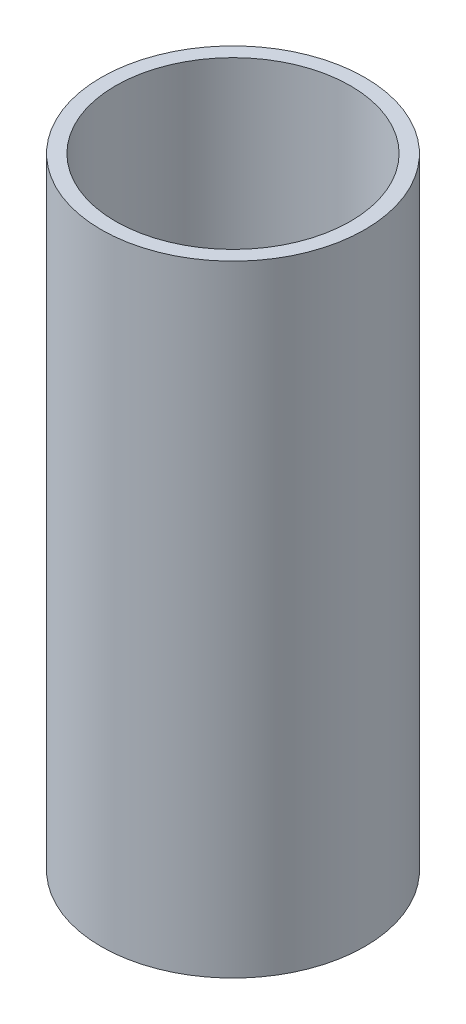
ISO-10303-21;
HEADER;
FILE_DESCRIPTION(('STEP AP214'),'2;1');
FILE_NAME('part.step','',(''),(''),'','','');
FILE_SCHEMA(('AUTOMOTIVE_DESIGN { 1 0 10303 214 1 1 1 1 }'));
ENDSEC;
DATA;
#1=APPLICATION_CONTEXT('core data for automotive mechanical design processes');
#2=APPLICATION_PROTOCOL_DEFINITION('international standard','automotive_design',2000,#1);
#3=PRODUCT_CONTEXT('',#1,'mechanical');
#4=PRODUCT('Part','Part','',(#3));
#5=PRODUCT_RELATED_PRODUCT_CATEGORY('part','',(#4));
#6=PRODUCT_DEFINITION_FORMATION('','',#4);
#7=PRODUCT_DEFINITION_CONTEXT('part definition',#1,'design');
#8=PRODUCT_DEFINITION('design','',#6,#7);
#9=PRODUCT_DEFINITION_SHAPE('','',#8);
#10=(LENGTH_UNIT() NAMED_UNIT(*) SI_UNIT(.MILLI.,.METRE.));
#11=(NAMED_UNIT(*) PLANE_ANGLE_UNIT() SI_UNIT($,.RADIAN.));
#12=(NAMED_UNIT(*) SI_UNIT($,.STERADIAN.) SOLID_ANGLE_UNIT());
#13=UNCERTAINTY_MEASURE_WITH_UNIT(LENGTH_MEASURE(1.E-05),#10,'distance_accuracy_value','');
#14=(GEOMETRIC_REPRESENTATION_CONTEXT(3) GLOBAL_UNCERTAINTY_ASSIGNED_CONTEXT((#13)) GLOBAL_UNIT_ASSIGNED_CONTEXT((#10,
#11,#12)) REPRESENTATION_CONTEXT('',''));
#15=CARTESIAN_POINT('',(0.,0.,0.));
#16=DIRECTION('',(0.,0.,1.));
#17=DIRECTION('',(1.,0.,0.));
#18=AXIS2_PLACEMENT_3D('',#15,#16,#17);
#19=CARTESIAN_POINT('',(0.,51.8,0.));
#20=DIRECTION('',(0.,1.,0.));
#21=DIRECTION('',(0.,0.,1.));
#22=AXIS2_PLACEMENT_3D('',#19,#20,#21);
#23=PLANE('',#22);
#24=CARTESIAN_POINT('',(0.,51.8,0.));
#25=DIRECTION('',(0.,1.,0.));
#26=DIRECTION('',(0.,0.,1.));
#27=AXIS2_PLACEMENT_3D('',#24,#25,#26);
#28=CIRCLE('',#27,11.);
#29=CARTESIAN_POINT('',(0.,51.8,-11.));
#30=VERTEX_POINT('',#29);
#31=EDGE_CURVE('E10',#30,#30,#28,.T.);
#32=ORIENTED_EDGE('',*,*,#31,.T.);
#33=EDGE_LOOP('',(#32));
#34=FACE_BOUND('',#33,.T.);
#35=CARTESIAN_POINT('',(0.,51.8,0.));
#36=DIRECTION('',(0.,1.,0.));
#37=DIRECTION('',(0.,0.,1.));
#38=AXIS2_PLACEMENT_3D('',#35,#36,#37);
#39=CIRCLE('',#38,9.8);
#40=CARTESIAN_POINT('',(0.,51.8,-9.8));
#41=VERTEX_POINT('',#40);
#42=EDGE_CURVE('E42',#41,#41,#39,.T.);
#43=ORIENTED_EDGE('',*,*,#42,.F.);
#44=EDGE_LOOP('',(#43));
#45=FACE_BOUND('',#44,.T.);
#46=ADVANCED_FACE('F31',(#34,#45),#23,.T.);
#47=CARTESIAN_POINT('',(0.,0.,0.));
#48=DIRECTION('',(0.,1.,0.));
#49=DIRECTION('',(0.,0.,1.));
#50=AXIS2_PLACEMENT_3D('',#47,#48,#49);
#51=PLANE('',#50);
#52=CARTESIAN_POINT('',(0.,0.,0.));
#53=DIRECTION('',(0.,1.,0.));
#54=DIRECTION('',(0.,0.,1.));
#55=AXIS2_PLACEMENT_3D('',#52,#53,#54);
#56=CIRCLE('',#55,11.);
#57=CARTESIAN_POINT('',(0.,0.,-11.));
#58=VERTEX_POINT('',#57);
#59=EDGE_CURVE('E35',#58,#58,#56,.T.);
#60=ORIENTED_EDGE('',*,*,#59,.F.);
#61=EDGE_LOOP('',(#60));
#62=FACE_BOUND('',#61,.T.);
#63=CARTESIAN_POINT('',(0.,0.,0.));
#64=DIRECTION('',(0.,1.,0.));
#65=DIRECTION('',(0.,0.,1.));
#66=AXIS2_PLACEMENT_3D('',#63,#64,#65);
#67=CIRCLE('',#66,9.8);
#68=CARTESIAN_POINT('',(0.,0.,-9.8));
#69=VERTEX_POINT('',#68);
#70=EDGE_CURVE('E44',#69,#69,#67,.T.);
#71=ORIENTED_EDGE('',*,*,#70,.T.);
#72=EDGE_LOOP('',(#71));
#73=FACE_BOUND('',#72,.T.);
#74=ADVANCED_FACE('F54',(#62,#73),#51,.F.);
#75=CARTESIAN_POINT('',(0.,51.8,0.));
#76=DIRECTION('',(0.,-1.,0.));
#77=DIRECTION('',(0.,0.,-1.));
#78=AXIS2_PLACEMENT_3D('',#75,#76,#77);
#79=CYLINDRICAL_SURFACE('',#78,11.);
#80=CARTESIAN_POINT('',(0.,51.8,-11.));
#81=CARTESIAN_POINT('',(0.,51.2604166666667,-11.));
#82=CARTESIAN_POINT('',(0.,50.7208333333333,-11.));
#83=CARTESIAN_POINT('',(0.,49.6416666666667,-11.));
#84=CARTESIAN_POINT('',(0.,49.1020833333333,-11.));
#85=CARTESIAN_POINT('',(0.,48.0229166666667,-11.));
#86=CARTESIAN_POINT('',(0.,47.4833333333333,-11.));
#87=CARTESIAN_POINT('',(0.,46.4041666666667,-11.));
#88=CARTESIAN_POINT('',(0.,45.8645833333333,-11.));
#89=CARTESIAN_POINT('',(0.,44.7854166666667,-11.));
#90=CARTESIAN_POINT('',(0.,44.2458333333333,-11.));
#91=CARTESIAN_POINT('',(0.,43.1666666666667,-11.));
#92=CARTESIAN_POINT('',(0.,42.6270833333333,-11.));
#93=CARTESIAN_POINT('',(0.,41.5479166666667,-11.));
#94=CARTESIAN_POINT('',(0.,41.0083333333333,-11.));
#95=CARTESIAN_POINT('',(0.,39.9291666666667,-11.));
#96=CARTESIAN_POINT('',(0.,39.3895833333333,-11.));
#97=CARTESIAN_POINT('',(0.,38.3104166666667,-11.));
#98=CARTESIAN_POINT('',(0.,37.7708333333333,-11.));
#99=CARTESIAN_POINT('',(0.,36.6916666666667,-11.));
#100=CARTESIAN_POINT('',(0.,36.1520833333333,-11.));
#101=CARTESIAN_POINT('',(0.,35.0729166666667,-11.));
#102=CARTESIAN_POINT('',(0.,34.5333333333333,-11.));
#103=CARTESIAN_POINT('',(0.,33.4541666666667,-11.));
#104=CARTESIAN_POINT('',(0.,32.9145833333333,-11.));
#105=CARTESIAN_POINT('',(0.,31.8354166666667,-11.));
#106=CARTESIAN_POINT('',(0.,31.2958333333333,-11.));
#107=CARTESIAN_POINT('',(0.,30.2166666666667,-11.));
#108=CARTESIAN_POINT('',(0.,29.6770833333333,-11.));
#109=CARTESIAN_POINT('',(0.,28.5979166666667,-11.));
#110=CARTESIAN_POINT('',(0.,28.0583333333333,-11.));
#111=CARTESIAN_POINT('',(0.,26.9791666666667,-11.));
#112=CARTESIAN_POINT('',(0.,26.4395833333333,-11.));
#113=CARTESIAN_POINT('',(0.,25.3604166666667,-11.));
#114=CARTESIAN_POINT('',(0.,24.8208333333333,-11.));
#115=CARTESIAN_POINT('',(0.,23.7416666666667,-11.));
#116=CARTESIAN_POINT('',(0.,23.2020833333333,-11.));
#117=CARTESIAN_POINT('',(0.,22.1229166666667,-11.));
#118=CARTESIAN_POINT('',(0.,21.5833333333333,-11.));
#119=CARTESIAN_POINT('',(0.,20.5041666666667,-11.));
#120=CARTESIAN_POINT('',(0.,19.9645833333333,-11.));
#121=CARTESIAN_POINT('',(0.,18.8854166666667,-11.));
#122=CARTESIAN_POINT('',(0.,18.3458333333333,-11.));
#123=CARTESIAN_POINT('',(0.,17.2666666666667,-11.));
#124=CARTESIAN_POINT('',(0.,16.7270833333333,-11.));
#125=CARTESIAN_POINT('',(0.,15.6479166666667,-11.));
#126=CARTESIAN_POINT('',(0.,15.1083333333333,-11.));
#127=CARTESIAN_POINT('',(0.,14.0291666666667,-11.));
#128=CARTESIAN_POINT('',(0.,13.4895833333333,-11.));
#129=CARTESIAN_POINT('',(0.,12.4104166666667,-11.));
#130=CARTESIAN_POINT('',(0.,11.8708333333333,-11.));
#131=CARTESIAN_POINT('',(0.,10.7916666666667,-11.));
#132=CARTESIAN_POINT('',(0.,10.2520833333333,-11.));
#133=CARTESIAN_POINT('',(0.,9.17291666666666,-11.));
#134=CARTESIAN_POINT('',(0.,8.63333333333333,-11.));
#135=CARTESIAN_POINT('',(0.,7.55416666666666,-11.));
#136=CARTESIAN_POINT('',(0.,7.01458333333333,-11.));
#137=CARTESIAN_POINT('',(0.,5.93541666666666,-11.));
#138=CARTESIAN_POINT('',(0.,5.39583333333333,-11.));
#139=CARTESIAN_POINT('',(0.,4.31666666666666,-11.));
#140=CARTESIAN_POINT('',(0.,3.77708333333332,-11.));
#141=CARTESIAN_POINT('',(0.,2.69791666666666,-11.));
#142=CARTESIAN_POINT('',(0.,2.15833333333333,-11.));
#143=CARTESIAN_POINT('',(0.,1.07916666666666,-11.));
#144=CARTESIAN_POINT('',(0.,0.539583333333327,-11.));
#145=CARTESIAN_POINT('',(0.,0.,-11.));
#146=B_SPLINE_CURVE_WITH_KNOTS('',3,(#80,#81,#82,#83,#84,#85,#86,#87,#88,#89,#90,#91,#92,#93,
#94,#95,#96,#97,#98,#99,#100,#101,#102,#103,#104,#105,#106,#107,#108,#109,#110,#111,#112,#113,
#114,#115,#116,#117,#118,#119,#120,#121,#122,#123,#124,#125,#126,#127,#128,#129,#130,#131,#132,
#133,#134,#135,#136,#137,#138,#139,#140,#141,#142,#143,#144,#145),.UNSPECIFIED.,.F.,.F.,(4,2,2,
2,2,2,2,2,2,2,2,2,2,2,2,2,2,2,2,2,2,2,2,2,2,2,2,2,2,2,2,2,4),(0.,1.61875,3.2375,4.85625,
6.47499999999999,8.09375,9.71249999999999,11.33125,12.95,14.56875,16.1875,17.80625,19.425,
21.04375,22.6625,24.28125,25.9,27.51875,29.1375,30.75625,32.375,33.99375,35.6125,37.23125,38.85,
40.46875,42.0875,43.70625,45.325,46.94375,48.5625,50.18125,51.8),.UNSPECIFIED.);
#147=EDGE_CURVE('BSEAM33',#30,#58,#146,.T.);
#148=ORIENTED_EDGE('',*,*,#31,.F.);
#149=ORIENTED_EDGE('',*,*,#59,.T.);
#150=ORIENTED_EDGE('',*,*,#147,.T.);
#151=ORIENTED_EDGE('',*,*,#147,.F.);
#152=EDGE_LOOP('',(#148,#150,#149,#151));
#153=FACE_BOUND('',#152,.T.);
#154=ADVANCED_FACE('F33',(#153),#79,.T.);
#155=CARTESIAN_POINT('',(0.,51.8,0.));
#156=DIRECTION('',(0.,-1.,0.));
#157=DIRECTION('',(0.,0.,-1.));
#158=AXIS2_PLACEMENT_3D('',#155,#156,#157);
#159=CYLINDRICAL_SURFACE('',#158,9.8);
#160=CARTESIAN_POINT('',(0.,51.8,-9.8));
#161=CARTESIAN_POINT('',(0.,51.2604166666667,-9.8));
#162=CARTESIAN_POINT('',(0.,50.7208333333333,-9.8));
#163=CARTESIAN_POINT('',(0.,49.6416666666667,-9.8));
#164=CARTESIAN_POINT('',(0.,49.1020833333333,-9.8));
#165=CARTESIAN_POINT('',(0.,48.0229166666667,-9.8));
#166=CARTESIAN_POINT('',(0.,47.4833333333333,-9.8));
#167=CARTESIAN_POINT('',(0.,46.4041666666667,-9.8));
#168=CARTESIAN_POINT('',(0.,45.8645833333333,-9.8));
#169=CARTESIAN_POINT('',(0.,44.7854166666667,-9.8));
#170=CARTESIAN_POINT('',(0.,44.2458333333333,-9.8));
#171=CARTESIAN_POINT('',(0.,43.1666666666667,-9.8));
#172=CARTESIAN_POINT('',(0.,42.6270833333333,-9.8));
#173=CARTESIAN_POINT('',(0.,41.5479166666667,-9.8));
#174=CARTESIAN_POINT('',(0.,41.0083333333333,-9.8));
#175=CARTESIAN_POINT('',(0.,39.9291666666667,-9.8));
#176=CARTESIAN_POINT('',(0.,39.3895833333333,-9.8));
#177=CARTESIAN_POINT('',(0.,38.3104166666667,-9.8));
#178=CARTESIAN_POINT('',(0.,37.7708333333333,-9.8));
#179=CARTESIAN_POINT('',(0.,36.6916666666667,-9.8));
#180=CARTESIAN_POINT('',(0.,36.1520833333333,-9.8));
#181=CARTESIAN_POINT('',(0.,35.0729166666667,-9.8));
#182=CARTESIAN_POINT('',(0.,34.5333333333333,-9.8));
#183=CARTESIAN_POINT('',(0.,33.4541666666667,-9.8));
#184=CARTESIAN_POINT('',(0.,32.9145833333333,-9.8));
#185=CARTESIAN_POINT('',(0.,31.8354166666667,-9.8));
#186=CARTESIAN_POINT('',(0.,31.2958333333333,-9.8));
#187=CARTESIAN_POINT('',(0.,30.2166666666667,-9.8));
#188=CARTESIAN_POINT('',(0.,29.6770833333333,-9.8));
#189=CARTESIAN_POINT('',(0.,28.5979166666667,-9.8));
#190=CARTESIAN_POINT('',(0.,28.0583333333333,-9.8));
#191=CARTESIAN_POINT('',(0.,26.9791666666667,-9.8));
#192=CARTESIAN_POINT('',(0.,26.4395833333333,-9.8));
#193=CARTESIAN_POINT('',(0.,25.3604166666667,-9.8));
#194=CARTESIAN_POINT('',(0.,24.8208333333333,-9.8));
#195=CARTESIAN_POINT('',(0.,23.7416666666667,-9.8));
#196=CARTESIAN_POINT('',(0.,23.2020833333333,-9.8));
#197=CARTESIAN_POINT('',(0.,22.1229166666667,-9.8));
#198=CARTESIAN_POINT('',(0.,21.5833333333333,-9.8));
#199=CARTESIAN_POINT('',(0.,20.5041666666667,-9.8));
#200=CARTESIAN_POINT('',(0.,19.9645833333333,-9.8));
#201=CARTESIAN_POINT('',(0.,18.8854166666667,-9.8));
#202=CARTESIAN_POINT('',(0.,18.3458333333333,-9.8));
#203=CARTESIAN_POINT('',(0.,17.2666666666667,-9.8));
#204=CARTESIAN_POINT('',(0.,16.7270833333333,-9.8));
#205=CARTESIAN_POINT('',(0.,15.6479166666667,-9.8));
#206=CARTESIAN_POINT('',(0.,15.1083333333333,-9.8));
#207=CARTESIAN_POINT('',(0.,14.0291666666667,-9.8));
#208=CARTESIAN_POINT('',(0.,13.4895833333333,-9.8));
#209=CARTESIAN_POINT('',(0.,12.4104166666667,-9.8));
#210=CARTESIAN_POINT('',(0.,11.8708333333333,-9.8));
#211=CARTESIAN_POINT('',(0.,10.7916666666667,-9.8));
#212=CARTESIAN_POINT('',(0.,10.2520833333333,-9.8));
#213=CARTESIAN_POINT('',(0.,9.17291666666666,-9.8));
#214=CARTESIAN_POINT('',(0.,8.63333333333333,-9.8));
#215=CARTESIAN_POINT('',(0.,7.55416666666666,-9.8));
#216=CARTESIAN_POINT('',(0.,7.01458333333333,-9.8));
#217=CARTESIAN_POINT('',(0.,5.93541666666666,-9.8));
#218=CARTESIAN_POINT('',(0.,5.39583333333333,-9.8));
#219=CARTESIAN_POINT('',(0.,4.31666666666666,-9.8));
#220=CARTESIAN_POINT('',(0.,3.77708333333333,-9.8));
#221=CARTESIAN_POINT('',(0.,2.69791666666666,-9.8));
#222=CARTESIAN_POINT('',(0.,2.15833333333333,-9.8));
#223=CARTESIAN_POINT('',(0.,1.07916666666666,-9.8));
#224=CARTESIAN_POINT('',(0.,0.539583333333327,-9.8));
#225=CARTESIAN_POINT('',(0.,0.,-9.8));
#226=B_SPLINE_CURVE_WITH_KNOTS('',3,(#160,#161,#162,#163,#164,#165,#166,#167,#168,#169,#170,
#171,#172,#173,#174,#175,#176,#177,#178,#179,#180,#181,#182,#183,#184,#185,#186,#187,#188,#189,
#190,#191,#192,#193,#194,#195,#196,#197,#198,#199,#200,#201,#202,#203,#204,#205,#206,#207,#208,
#209,#210,#211,#212,#213,#214,#215,#216,#217,#218,#219,#220,#221,#222,#223,#224,#225),
.UNSPECIFIED.,.F.,.F.,(4,2,2,2,2,2,2,2,2,2,2,2,2,2,2,2,2,2,2,2,2,2,2,2,2,2,2,2,2,2,2,2,4),(0.,
1.61875,3.2375,4.85625000000001,6.475,8.09375,9.71250000000001,11.33125,12.95,14.56875,16.1875,
17.80625,19.425,21.04375,22.6625,24.28125,25.9,27.51875,29.1375,30.75625,32.375,33.99375,
35.6125,37.23125,38.85,40.46875,42.0875,43.70625,45.325,46.94375,48.5625,50.18125,51.8),.UNSPECIFIED.);
#227=EDGE_CURVE('BSEAM50',#41,#69,#226,.T.);
#228=ORIENTED_EDGE('',*,*,#42,.T.);
#229=ORIENTED_EDGE('',*,*,#70,.F.);
#230=ORIENTED_EDGE('',*,*,#227,.T.);
#231=ORIENTED_EDGE('',*,*,#227,.F.);
#232=EDGE_LOOP('',(#228,#230,#229,#231));
#233=FACE_BOUND('',#232,.T.);
#234=ADVANCED_FACE('F50',(#233),#159,.F.);
#235=CLOSED_SHELL('',(#46,#74,#154,#234));
#236=MANIFOLD_SOLID_BREP('B2',#235);
#237=ADVANCED_BREP_SHAPE_REPRESENTATION('',(#18,#236),#14);
#238=SHAPE_DEFINITION_REPRESENTATION(#9,#237);
ENDSEC;
END-ISO-10303-21;
